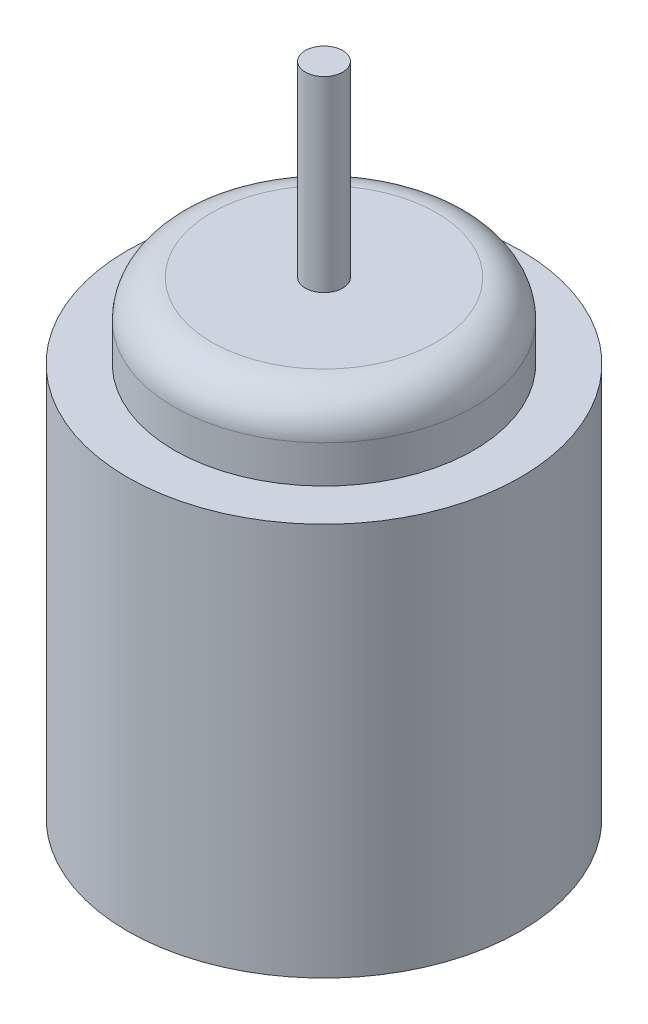
ISO-10303-21;
HEADER;
FILE_DESCRIPTION(('STEP AP214'),'2;1');
FILE_NAME('part.step','',(''),(''),'','','');
FILE_SCHEMA(('AUTOMOTIVE_DESIGN { 1 0 10303 214 1 1 1 1 }'));
ENDSEC;
DATA;
#1=APPLICATION_CONTEXT('core data for automotive mechanical design processes');
#2=APPLICATION_PROTOCOL_DEFINITION('international standard','automotive_design',2000,#1);
#3=PRODUCT_CONTEXT('',#1,'mechanical');
#4=PRODUCT('Part','Part','',(#3));
#5=PRODUCT_RELATED_PRODUCT_CATEGORY('part','',(#4));
#6=PRODUCT_DEFINITION_FORMATION('','',#4);
#7=PRODUCT_DEFINITION_CONTEXT('part definition',#1,'design');
#8=PRODUCT_DEFINITION('design','',#6,#7);
#9=PRODUCT_DEFINITION_SHAPE('','',#8);
#10=(LENGTH_UNIT() NAMED_UNIT(*) SI_UNIT(.MILLI.,.METRE.));
#11=(NAMED_UNIT(*) PLANE_ANGLE_UNIT() SI_UNIT($,.RADIAN.));
#12=(NAMED_UNIT(*) SI_UNIT($,.STERADIAN.) SOLID_ANGLE_UNIT());
#13=UNCERTAINTY_MEASURE_WITH_UNIT(LENGTH_MEASURE(1.E-05),#10,'distance_accuracy_value','');
#14=(GEOMETRIC_REPRESENTATION_CONTEXT(3) GLOBAL_UNCERTAINTY_ASSIGNED_CONTEXT((#13)) GLOBAL_UNIT_ASSIGNED_CONTEXT((#10,
#11,#12)) REPRESENTATION_CONTEXT('',''));
#15=CARTESIAN_POINT('',(0.,0.,0.));
#16=DIRECTION('',(0.,0.,1.));
#17=DIRECTION('',(1.,0.,0.));
#18=AXIS2_PLACEMENT_3D('',#15,#16,#17);
#19=CARTESIAN_POINT('',(0.,21.,0.));
#20=DIRECTION('',(0.,-1.,0.));
#21=DIRECTION('',(0.,0.,-1.));
#22=AXIS2_PLACEMENT_3D('',#19,#20,#21);
#23=CYLINDRICAL_SURFACE('',#22,10.5);
#24=CARTESIAN_POINT('',(0.,21.,0.));
#25=DIRECTION('',(0.,1.,0.));
#26=DIRECTION('',(0.,0.,1.));
#27=AXIS2_PLACEMENT_3D('',#24,#25,#26);
#28=CIRCLE('',#27,10.5);
#29=CARTESIAN_POINT('',(0.,21.,-10.5));
#30=VERTEX_POINT('',#29);
#31=EDGE_CURVE('E48',#30,#30,#28,.T.);
#32=CARTESIAN_POINT('',(0.,0.,0.));
#33=DIRECTION('',(0.,1.,0.));
#34=DIRECTION('',(0.,0.,1.));
#35=AXIS2_PLACEMENT_3D('',#32,#33,#34);
#36=CIRCLE('',#35,10.5);
#37=CARTESIAN_POINT('',(0.,0.,-10.5));
#38=VERTEX_POINT('',#37);
#39=EDGE_CURVE('E51',#38,#38,#36,.T.);
#40=CARTESIAN_POINT('',(0.,21.,-10.5));
#41=CARTESIAN_POINT('',(0.,20.78125,-10.5));
#42=CARTESIAN_POINT('',(0.,20.5625,-10.5));
#43=CARTESIAN_POINT('',(0.,20.125,-10.5));
#44=CARTESIAN_POINT('',(0.,19.90625,-10.5));
#45=CARTESIAN_POINT('',(0.,19.46875,-10.5));
#46=CARTESIAN_POINT('',(0.,19.25,-10.5));
#47=CARTESIAN_POINT('',(0.,18.8125,-10.5));
#48=CARTESIAN_POINT('',(0.,18.59375,-10.5));
#49=CARTESIAN_POINT('',(0.,18.15625,-10.5));
#50=CARTESIAN_POINT('',(0.,17.9375,-10.5));
#51=CARTESIAN_POINT('',(0.,17.5,-10.5));
#52=CARTESIAN_POINT('',(0.,17.28125,-10.5));
#53=CARTESIAN_POINT('',(0.,16.84375,-10.5));
#54=CARTESIAN_POINT('',(0.,16.625,-10.5));
#55=CARTESIAN_POINT('',(0.,16.1875,-10.5));
#56=CARTESIAN_POINT('',(0.,15.96875,-10.5));
#57=CARTESIAN_POINT('',(0.,15.53125,-10.5));
#58=CARTESIAN_POINT('',(0.,15.3125,-10.5));
#59=CARTESIAN_POINT('',(0.,14.875,-10.5));
#60=CARTESIAN_POINT('',(0.,14.65625,-10.5));
#61=CARTESIAN_POINT('',(0.,14.21875,-10.5));
#62=CARTESIAN_POINT('',(0.,14.,-10.5));
#63=CARTESIAN_POINT('',(0.,13.5625,-10.5));
#64=CARTESIAN_POINT('',(0.,13.34375,-10.5));
#65=CARTESIAN_POINT('',(0.,12.90625,-10.5));
#66=CARTESIAN_POINT('',(0.,12.6875,-10.5));
#67=CARTESIAN_POINT('',(0.,12.25,-10.5));
#68=CARTESIAN_POINT('',(0.,12.03125,-10.5));
#69=CARTESIAN_POINT('',(0.,11.59375,-10.5));
#70=CARTESIAN_POINT('',(0.,11.375,-10.5));
#71=CARTESIAN_POINT('',(0.,10.9375,-10.5));
#72=CARTESIAN_POINT('',(0.,10.71875,-10.5));
#73=CARTESIAN_POINT('',(0.,10.28125,-10.5));
#74=CARTESIAN_POINT('',(0.,10.0625,-10.5));
#75=CARTESIAN_POINT('',(0.,9.625,-10.5));
#76=CARTESIAN_POINT('',(0.,9.40625,-10.5));
#77=CARTESIAN_POINT('',(0.,8.96875,-10.5));
#78=CARTESIAN_POINT('',(0.,8.75,-10.5));
#79=CARTESIAN_POINT('',(0.,8.3125,-10.5));
#80=CARTESIAN_POINT('',(0.,8.09375,-10.5));
#81=CARTESIAN_POINT('',(0.,7.65625,-10.5));
#82=CARTESIAN_POINT('',(0.,7.4375,-10.5));
#83=CARTESIAN_POINT('',(0.,7.,-10.5));
#84=CARTESIAN_POINT('',(0.,6.78125,-10.5));
#85=CARTESIAN_POINT('',(0.,6.34375,-10.5));
#86=CARTESIAN_POINT('',(0.,6.125,-10.5));
#87=CARTESIAN_POINT('',(0.,5.6875,-10.5));
#88=CARTESIAN_POINT('',(0.,5.46875,-10.5));
#89=CARTESIAN_POINT('',(0.,5.03125,-10.5));
#90=CARTESIAN_POINT('',(0.,4.8125,-10.5));
#91=CARTESIAN_POINT('',(0.,4.375,-10.5));
#92=CARTESIAN_POINT('',(0.,4.15625,-10.5));
#93=CARTESIAN_POINT('',(0.,3.71875,-10.5));
#94=CARTESIAN_POINT('',(0.,3.5,-10.5));
#95=CARTESIAN_POINT('',(0.,3.0625,-10.5));
#96=CARTESIAN_POINT('',(0.,2.84375,-10.5));
#97=CARTESIAN_POINT('',(0.,2.40625,-10.5));
#98=CARTESIAN_POINT('',(0.,2.1875,-10.5));
#99=CARTESIAN_POINT('',(0.,1.75,-10.5));
#100=CARTESIAN_POINT('',(0.,1.53125,-10.5));
#101=CARTESIAN_POINT('',(0.,1.09375,-10.5));
#102=CARTESIAN_POINT('',(0.,0.875000000000001,-10.5));
#103=CARTESIAN_POINT('',(0.,0.4375,-10.5));
#104=CARTESIAN_POINT('',(0.,0.21875,-10.5));
#105=CARTESIAN_POINT('',(0.,0.,-10.5));
#106=B_SPLINE_CURVE_WITH_KNOTS('',3,(#40,#41,#42,#43,#44,#45,#46,#47,#48,#49,#50,#51,#52,#53,
#54,#55,#56,#57,#58,#59,#60,#61,#62,#63,#64,#65,#66,#67,#68,#69,#70,#71,#72,#73,#74,#75,#76,#77,
#78,#79,#80,#81,#82,#83,#84,#85,#86,#87,#88,#89,#90,#91,#92,#93,#94,#95,#96,#97,#98,#99,#100,
#101,#102,#103,#104,#105),.UNSPECIFIED.,.F.,.F.,(4,2,2,2,2,2,2,2,2,2,2,2,2,2,2,2,2,2,2,2,2,2,2,
2,2,2,2,2,2,2,2,2,4),(0.,0.656250000000001,1.3125,1.96875,2.625,3.28125,3.9375,4.59375,5.25,
5.90625,6.5625,7.21875,7.875,8.53125,9.1875,9.84375,10.5,11.15625,11.8125,12.46875,13.125,
13.78125,14.4375,15.09375,15.75,16.40625,17.0625,17.71875,18.375,19.03125,19.6875,20.34375,21.),.UNSPECIFIED.);
#107=EDGE_CURVE('BSEAM33',#30,#38,#106,.T.);
#108=ORIENTED_EDGE('',*,*,#31,.F.);
#109=ORIENTED_EDGE('',*,*,#39,.T.);
#110=ORIENTED_EDGE('',*,*,#107,.T.);
#111=ORIENTED_EDGE('',*,*,#107,.F.);
#112=EDGE_LOOP('',(#108,#110,#109,#111));
#113=FACE_BOUND('',#112,.T.);
#114=ADVANCED_FACE('F33',(#113),#23,.T.);
#115=CARTESIAN_POINT('',(0.,21.,0.));
#116=DIRECTION('',(0.,1.,0.));
#117=DIRECTION('',(0.,0.,1.));
#118=AXIS2_PLACEMENT_3D('',#115,#116,#117);
#119=PLANE('',#118);
#120=CARTESIAN_POINT('',(0.,21.,0.));
#121=DIRECTION('',(0.,1.,0.));
#122=DIRECTION('',(0.,0.,1.));
#123=AXIS2_PLACEMENT_3D('',#120,#121,#122);
#124=CIRCLE('',#123,8.);
#125=CARTESIAN_POINT('',(0.,21.,8.));
#126=VERTEX_POINT('',#125);
#127=EDGE_CURVE('E44',#126,#126,#124,.T.);
#128=ORIENTED_EDGE('',*,*,#127,.F.);
#129=EDGE_LOOP('',(#128));
#130=FACE_BOUND('',#129,.T.);
#131=ORIENTED_EDGE('',*,*,#31,.T.);
#132=EDGE_LOOP('',(#131));
#133=FACE_BOUND('',#132,.T.);
#134=ADVANCED_FACE('F83',(#130,#133),#119,.T.);
#135=CARTESIAN_POINT('',(0.,0.,0.));
#136=DIRECTION('',(0.,1.,0.));
#137=DIRECTION('',(0.,0.,1.));
#138=AXIS2_PLACEMENT_3D('',#135,#136,#137);
#139=PLANE('',#138);
#140=ORIENTED_EDGE('',*,*,#39,.F.);
#141=EDGE_LOOP('',(#140));
#142=FACE_BOUND('',#141,.T.);
#143=ADVANCED_FACE('F80',(#142),#139,.F.);
#144=CARTESIAN_POINT('',(0.,25.,0.));
#145=DIRECTION('',(0.,-1.,0.));
#146=DIRECTION('',(0.,0.,-1.));
#147=AXIS2_PLACEMENT_3D('',#144,#145,#146);
#148=CYLINDRICAL_SURFACE('',#147,8.);
#149=CARTESIAN_POINT('',(0.,23.,0.));
#150=DIRECTION('',(0.,1.,0.));
#151=DIRECTION('',(0.,0.,1.));
#152=AXIS2_PLACEMENT_3D('',#149,#150,#151);
#153=CIRCLE('',#152,8.);
#154=CARTESIAN_POINT('',(0.,23.,8.));
#155=VERTEX_POINT('',#154);
#156=EDGE_CURVE('E10',#155,#155,#153,.F.);
#157=ORIENTED_EDGE('',*,*,#156,.T.);
#158=EDGE_LOOP('',(#157));
#159=FACE_BOUND('',#158,.T.);
#160=ORIENTED_EDGE('',*,*,#127,.T.);
#161=EDGE_LOOP('',(#160));
#162=FACE_BOUND('',#161,.T.);
#163=ADVANCED_FACE('F73',(#159,#162),#148,.T.);
#164=CARTESIAN_POINT('',(0.,25.,0.));
#165=DIRECTION('',(0.,1.,0.));
#166=DIRECTION('',(0.,0.,1.));
#167=AXIS2_PLACEMENT_3D('',#164,#165,#166);
#168=PLANE('',#167);
#169=CARTESIAN_POINT('',(0.,25.,0.));
#170=DIRECTION('',(0.,1.,0.));
#171=DIRECTION('',(0.,0.,1.));
#172=AXIS2_PLACEMENT_3D('',#169,#170,#171);
#173=CIRCLE('',#172,1.);
#174=CARTESIAN_POINT('',(0.,25.,1.));
#175=VERTEX_POINT('',#174);
#176=EDGE_CURVE('E57',#175,#175,#173,.T.);
#177=ORIENTED_EDGE('',*,*,#176,.F.);
#178=EDGE_LOOP('',(#177));
#179=FACE_BOUND('',#178,.T.);
#180=CARTESIAN_POINT('',(0.,25.,0.));
#181=DIRECTION('',(0.,1.,0.));
#182=DIRECTION('',(0.,0.,1.));
#183=AXIS2_PLACEMENT_3D('',#180,#181,#182);
#184=CIRCLE('',#183,6.);
#185=CARTESIAN_POINT('',(0.,25.,6.));
#186=VERTEX_POINT('',#185);
#187=EDGE_CURVE('E40',#186,#186,#184,.T.);
#188=ORIENTED_EDGE('',*,*,#187,.T.);
#189=EDGE_LOOP('',(#188));
#190=FACE_BOUND('',#189,.T.);
#191=ADVANCED_FACE('F71',(#179,#190),#168,.T.);
#192=CARTESIAN_POINT('',(0.,23.,0.));
#193=DIRECTION('',(0.,1.,0.));
#194=DIRECTION('',(0.,0.,1.));
#195=AXIS2_PLACEMENT_3D('',#192,#193,#194);
#196=TOROIDAL_SURFACE('',#195,6.,2.);
#197=ORIENTED_EDGE('',*,*,#156,.F.);
#198=EDGE_LOOP('',(#197));
#199=FACE_BOUND('',#198,.T.);
#200=ORIENTED_EDGE('',*,*,#187,.F.);
#201=EDGE_LOOP('',(#200));
#202=FACE_BOUND('',#201,.T.);
#203=ADVANCED_FACE('F35',(#199,#202),#196,.T.);
#204=CARTESIAN_POINT('',(0.,35.,0.));
#205=DIRECTION('',(0.,-1.,0.));
#206=DIRECTION('',(0.,0.,-1.));
#207=AXIS2_PLACEMENT_3D('',#204,#205,#206);
#208=CYLINDRICAL_SURFACE('',#207,1.);
#209=CARTESIAN_POINT('',(0.,35.,0.));
#210=DIRECTION('',(0.,1.,0.));
#211=DIRECTION('',(0.,0.,1.));
#212=AXIS2_PLACEMENT_3D('',#209,#210,#211);
#213=CIRCLE('',#212,1.);
#214=CARTESIAN_POINT('',(0.,35.,1.));
#215=VERTEX_POINT('',#214);
#216=EDGE_CURVE('E54',#215,#215,#213,.T.);
#217=ORIENTED_EDGE('',*,*,#216,.F.);
#218=EDGE_LOOP('',(#217));
#219=FACE_BOUND('',#218,.T.);
#220=ORIENTED_EDGE('',*,*,#176,.T.);
#221=EDGE_LOOP('',(#220));
#222=FACE_BOUND('',#221,.T.);
#223=ADVANCED_FACE('F65',(#219,#222),#208,.T.);
#224=CARTESIAN_POINT('',(0.,35.,0.));
#225=DIRECTION('',(0.,1.,0.));
#226=DIRECTION('',(0.,0.,1.));
#227=AXIS2_PLACEMENT_3D('',#224,#225,#226);
#228=PLANE('',#227);
#229=ORIENTED_EDGE('',*,*,#216,.T.);
#230=EDGE_LOOP('',(#229));
#231=FACE_BOUND('',#230,.T.);
#232=ADVANCED_FACE('F63',(#231),#228,.T.);
#233=CLOSED_SHELL('',(#114,#134,#143,#163,#191,#203,#223,#232));
#234=MANIFOLD_SOLID_BREP('B2',#233);
#235=ADVANCED_BREP_SHAPE_REPRESENTATION('',(#18,#234),#14);
#236=SHAPE_DEFINITION_REPRESENTATION(#9,#235);
ENDSEC;
END-ISO-10303-21;
